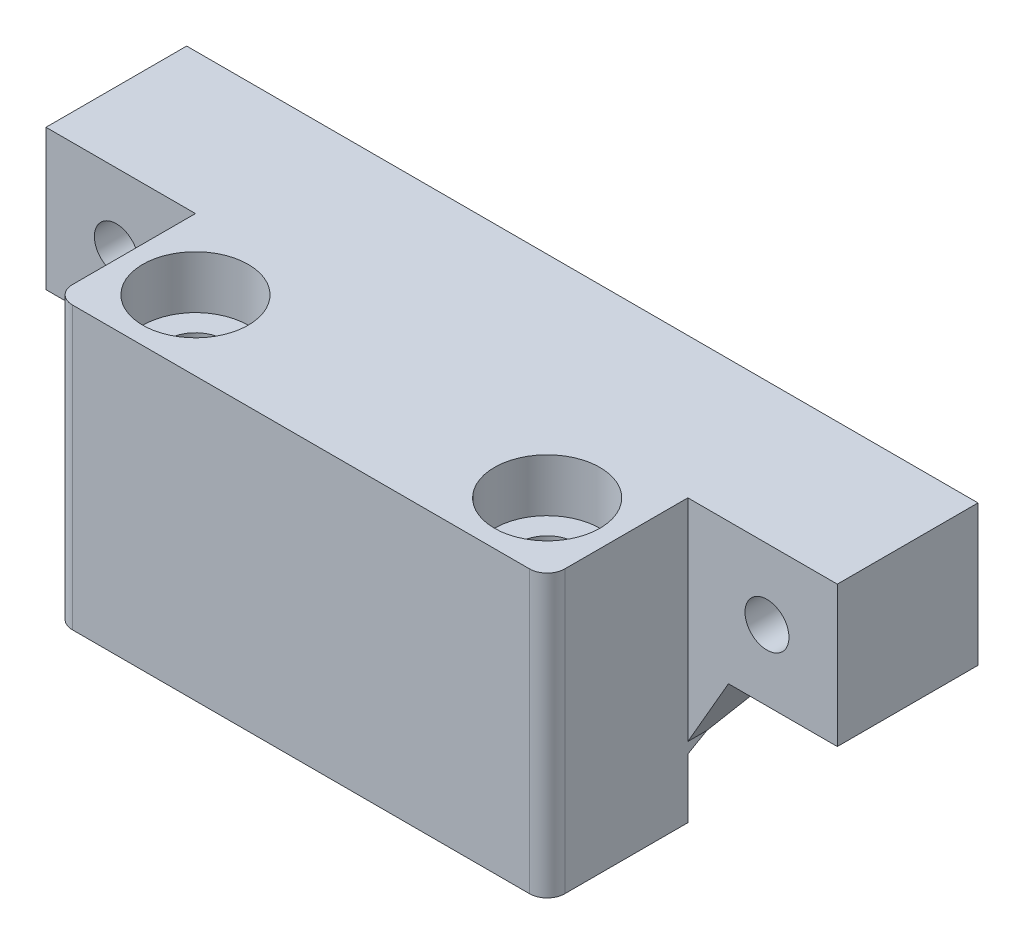
ISO-10303-21;
HEADER;
FILE_DESCRIPTION(('STEP AP214'),'2;1');
FILE_NAME('part.step','',(''),(''),'','','');
FILE_SCHEMA(('AUTOMOTIVE_DESIGN { 1 0 10303 214 1 1 1 1 }'));
ENDSEC;
DATA;
#1=APPLICATION_CONTEXT('core data for automotive mechanical design processes');
#2=APPLICATION_PROTOCOL_DEFINITION('international standard','automotive_design',2000,#1);
#3=PRODUCT_CONTEXT('',#1,'mechanical');
#4=PRODUCT('Part','Part','',(#3));
#5=PRODUCT_RELATED_PRODUCT_CATEGORY('part','',(#4));
#6=PRODUCT_DEFINITION_FORMATION('','',#4);
#7=PRODUCT_DEFINITION_CONTEXT('part definition',#1,'design');
#8=PRODUCT_DEFINITION('design','',#6,#7);
#9=PRODUCT_DEFINITION_SHAPE('','',#8);
#10=(LENGTH_UNIT() NAMED_UNIT(*) SI_UNIT(.MILLI.,.METRE.));
#11=(NAMED_UNIT(*) PLANE_ANGLE_UNIT() SI_UNIT($,.RADIAN.));
#12=(NAMED_UNIT(*) SI_UNIT($,.STERADIAN.) SOLID_ANGLE_UNIT());
#13=UNCERTAINTY_MEASURE_WITH_UNIT(LENGTH_MEASURE(1.E-05),#10,'distance_accuracy_value','');
#14=(GEOMETRIC_REPRESENTATION_CONTEXT(3) GLOBAL_UNCERTAINTY_ASSIGNED_CONTEXT((#13)) GLOBAL_UNIT_ASSIGNED_CONTEXT((#10,
#11,#12)) REPRESENTATION_CONTEXT('',''));
#15=CARTESIAN_POINT('',(0.,0.,0.));
#16=DIRECTION('',(0.,0.,1.));
#17=DIRECTION('',(1.,0.,0.));
#18=AXIS2_PLACEMENT_3D('',#15,#16,#17);
#19=CARTESIAN_POINT('',(-18.5,0.,8.));
#20=DIRECTION('',(0.,0.,-1.));
#21=DIRECTION('',(-1.,0.,0.));
#22=AXIS2_PLACEMENT_3D('',#19,#20,#21);
#23=CYLINDRICAL_SURFACE('',#22,1.25);
#24=CARTESIAN_POINT('',(-18.5,0.,8.));
#25=DIRECTION('',(0.,0.,1.));
#26=DIRECTION('',(1.,0.,0.));
#27=AXIS2_PLACEMENT_3D('',#24,#25,#26);
#28=CIRCLE('',#27,1.25);
#29=CARTESIAN_POINT('',(-17.25,0.,8.));
#30=VERTEX_POINT('',#29);
#31=EDGE_CURVE('E129',#30,#30,#28,.T.);
#32=ORIENTED_EDGE('',*,*,#31,.T.);
#33=EDGE_LOOP('',(#32));
#34=FACE_BOUND('',#33,.T.);
#35=CARTESIAN_POINT('',(-18.5,0.,5.));
#36=DIRECTION('',(0.,0.,-1.));
#37=DIRECTION('',(-1.,0.,0.));
#38=AXIS2_PLACEMENT_3D('',#35,#36,#37);
#39=CIRCLE('',#38,1.25);
#40=CARTESIAN_POINT('',(-19.75,0.,5.));
#41=VERTEX_POINT('',#40);
#42=EDGE_CURVE('E40',#41,#41,#39,.T.);
#43=ORIENTED_EDGE('',*,*,#42,.T.);
#44=EDGE_LOOP('',(#43));
#45=FACE_BOUND('',#44,.T.);
#46=ADVANCED_FACE('F35',(#34,#45),#23,.F.);
#47=CARTESIAN_POINT('',(18.5,0.,8.));
#48=DIRECTION('',(0.,0.,-1.));
#49=DIRECTION('',(-1.,0.,0.));
#50=AXIS2_PLACEMENT_3D('',#47,#48,#49);
#51=CYLINDRICAL_SURFACE('',#50,1.25);
#52=CARTESIAN_POINT('',(18.5,0.,8.));
#53=DIRECTION('',(0.,0.,1.));
#54=DIRECTION('',(-1.,0.,0.));
#55=AXIS2_PLACEMENT_3D('',#52,#53,#54);
#56=CIRCLE('',#55,1.25);
#57=CARTESIAN_POINT('',(17.25,0.,8.));
#58=VERTEX_POINT('',#57);
#59=EDGE_CURVE('E253',#58,#58,#56,.T.);
#60=ORIENTED_EDGE('',*,*,#59,.T.);
#61=EDGE_LOOP('',(#60));
#62=FACE_BOUND('',#61,.T.);
#63=CARTESIAN_POINT('',(18.5,0.,5.));
#64=DIRECTION('',(0.,0.,-1.));
#65=DIRECTION('',(-1.,0.,0.));
#66=AXIS2_PLACEMENT_3D('',#63,#64,#65);
#67=CIRCLE('',#66,1.25);
#68=CARTESIAN_POINT('',(17.25,0.,5.));
#69=VERTEX_POINT('',#68);
#70=EDGE_CURVE('E194',#69,#69,#67,.T.);
#71=ORIENTED_EDGE('',*,*,#70,.T.);
#72=EDGE_LOOP('',(#71));
#73=FACE_BOUND('',#72,.T.);
#74=ADVANCED_FACE('F378',(#62,#73),#51,.F.);
#75=CARTESIAN_POINT('',(-22.5,-4.,8.));
#76=DIRECTION('',(0.,1.,0.));
#77=DIRECTION('',(0.,0.,1.));
#78=AXIS2_PLACEMENT_3D('',#75,#76,#77);
#79=PLANE('',#78);
#80=DIRECTION('',(1.,0.,0.));
#81=VECTOR('',#80,1.);
#82=CARTESIAN_POINT('',(-22.5,-4.,8.));
#83=LINE('',#82,#81);
#84=CARTESIAN_POINT('',(16.3094010767585,-4.,8.));
#85=VERTEX_POINT('',#84);
#86=CARTESIAN_POINT('',(22.5,-4.,8.));
#87=VERTEX_POINT('',#86);
#88=EDGE_CURVE('E117',#85,#87,#83,.T.);
#89=ORIENTED_EDGE('',*,*,#88,.F.);
#90=DIRECTION('',(0.,0.,-1.));
#91=VECTOR('',#90,1.);
#92=CARTESIAN_POINT('',(16.3094010767585,-4.,8.00000000000001));
#93=LINE('',#92,#91);
#94=CARTESIAN_POINT('',(16.3094010767585,-4.,0.));
#95=VERTEX_POINT('',#94);
#96=EDGE_CURVE('E186',#85,#95,#93,.T.);
#97=ORIENTED_EDGE('',*,*,#96,.T.);
#98=DIRECTION('',(1.,0.,0.));
#99=VECTOR('',#98,1.);
#100=CARTESIAN_POINT('',(-22.5,-4.,0.));
#101=LINE('',#100,#99);
#102=CARTESIAN_POINT('',(22.5,-4.,0.));
#103=VERTEX_POINT('',#102);
#104=EDGE_CURVE('E135',#95,#103,#101,.T.);
#105=ORIENTED_EDGE('',*,*,#104,.T.);
#106=DIRECTION('',(0.,0.,-1.));
#107=VECTOR('',#106,1.);
#108=CARTESIAN_POINT('',(22.5,-4.,8.));
#109=LINE('',#108,#107);
#110=EDGE_CURVE('E116',#87,#103,#109,.T.);
#111=ORIENTED_EDGE('',*,*,#110,.F.);
#112=EDGE_LOOP('',(#89,#97,#105,#111));
#113=FACE_BOUND('',#112,.T.);
#114=ADVANCED_FACE('F336',(#113),#79,.F.);
#115=CARTESIAN_POINT('',(10.,4.,12.));
#116=DIRECTION('',(0.,-1.,0.));
#117=DIRECTION('',(0.,0.,-1.));
#118=AXIS2_PLACEMENT_3D('',#115,#116,#117);
#119=CYLINDRICAL_SURFACE('',#118,1.60000000000001);
#120=CARTESIAN_POINT('',(10.,-12.,12.));
#121=DIRECTION('',(0.,-1.,0.));
#122=DIRECTION('',(0.,0.,1.));
#123=AXIS2_PLACEMENT_3D('',#120,#121,#122);
#124=CIRCLE('',#123,1.60000000000001);
#125=CARTESIAN_POINT('',(10.,-12.,13.6));
#126=VERTEX_POINT('',#125);
#127=EDGE_CURVE('E153',#126,#126,#124,.T.);
#128=ORIENTED_EDGE('',*,*,#127,.T.);
#129=EDGE_LOOP('',(#128));
#130=FACE_BOUND('',#129,.T.);
#131=CARTESIAN_POINT('',(10.,1.,12.));
#132=DIRECTION('',(0.,1.,0.));
#133=DIRECTION('',(0.,0.,1.));
#134=AXIS2_PLACEMENT_3D('',#131,#132,#133);
#135=CIRCLE('',#134,1.60000000000001);
#136=CARTESIAN_POINT('',(10.,1.,13.6));
#137=VERTEX_POINT('',#136);
#138=EDGE_CURVE('E146',#137,#137,#135,.F.);
#139=ORIENTED_EDGE('',*,*,#138,.F.);
#140=EDGE_LOOP('',(#139));
#141=FACE_BOUND('',#140,.T.);
#142=ADVANCED_FACE('F365',(#130,#141),#119,.F.);
#143=CARTESIAN_POINT('',(0.,0.,8.));
#144=DIRECTION('',(0.,0.,1.));
#145=DIRECTION('',(1.,0.,0.));
#146=AXIS2_PLACEMENT_3D('',#143,#144,#145);
#147=PLANE('',#146);
#148=ORIENTED_EDGE('',*,*,#59,.F.);
#149=EDGE_LOOP('',(#148));
#150=FACE_BOUND('',#149,.T.);
#151=DIRECTION('',(-1.,0.,0.));
#152=VECTOR('',#151,1.);
#153=CARTESIAN_POINT('',(-22.5,4.,8.));
#154=LINE('',#153,#152);
#155=CARTESIAN_POINT('',(22.5,4.,8.));
#156=VERTEX_POINT('',#155);
#157=CARTESIAN_POINT('',(14.,4.,8.));
#158=VERTEX_POINT('',#157);
#159=EDGE_CURVE('E262',#156,#158,#154,.T.);
#160=ORIENTED_EDGE('',*,*,#159,.T.);
#161=DIRECTION('',(0.,-1.,0.));
#162=VECTOR('',#161,1.);
#163=CARTESIAN_POINT('',(14.,4.,8.));
#164=LINE('',#163,#162);
#165=CARTESIAN_POINT('',(14.,-8.00000000000001,8.));
#166=VERTEX_POINT('',#165);
#167=EDGE_CURVE('E251',#158,#166,#164,.T.);
#168=ORIENTED_EDGE('',*,*,#167,.T.);
#169=DIRECTION('',(0.500000000000006,0.866025403784435,0.));
#170=VECTOR('',#169,1.);
#171=CARTESIAN_POINT('',(16.3094010767585,-4.,8.00000000000001));
#172=LINE('',#171,#170);
#173=EDGE_CURVE('E82',#166,#85,#172,.T.);
#174=ORIENTED_EDGE('',*,*,#173,.T.);
#175=ORIENTED_EDGE('',*,*,#88,.T.);
#176=DIRECTION('',(0.,1.,0.));
#177=VECTOR('',#176,1.);
#178=CARTESIAN_POINT('',(22.5,4.,8.));
#179=LINE('',#178,#177);
#180=EDGE_CURVE('E136',#87,#156,#179,.T.);
#181=ORIENTED_EDGE('',*,*,#180,.T.);
#182=EDGE_LOOP('',(#160,#168,#174,#175,#181));
#183=FACE_BOUND('',#182,.T.);
#184=ADVANCED_FACE('F363',(#150,#183),#147,.T.);
#185=DIRECTION('',(0.,-1.,0.));
#186=VECTOR('',#185,1.);
#187=CARTESIAN_POINT('',(-14.,4.,8.));
#188=LINE('',#187,#186);
#189=CARTESIAN_POINT('',(-14.,4.,8.));
#190=VERTEX_POINT('',#189);
#191=CARTESIAN_POINT('',(-14.,-8.00000000000001,8.));
#192=VERTEX_POINT('',#191);
#193=EDGE_CURVE('E62',#190,#192,#188,.T.);
#194=ORIENTED_EDGE('',*,*,#193,.F.);
#195=CARTESIAN_POINT('',(-22.5,4.,8.));
#196=VERTEX_POINT('',#195);
#197=EDGE_CURVE('E261',#190,#196,#154,.T.);
#198=ORIENTED_EDGE('',*,*,#197,.T.);
#199=DIRECTION('',(0.,-1.,0.));
#200=VECTOR('',#199,1.);
#201=CARTESIAN_POINT('',(-22.5,4.,8.));
#202=LINE('',#201,#200);
#203=CARTESIAN_POINT('',(-22.5,-4.,8.));
#204=VERTEX_POINT('',#203);
#205=EDGE_CURVE('E114',#196,#204,#202,.T.);
#206=ORIENTED_EDGE('',*,*,#205,.T.);
#207=CARTESIAN_POINT('',(-16.3094010767586,-4.,8.));
#208=VERTEX_POINT('',#207);
#209=EDGE_CURVE('E105',#204,#208,#83,.T.);
#210=ORIENTED_EDGE('',*,*,#209,.T.);
#211=DIRECTION('',(0.500000000000006,-0.866025403784435,0.));
#212=VECTOR('',#211,1.);
#213=CARTESIAN_POINT('',(-16.3094010767585,-4.,8.));
#214=LINE('',#213,#212);
#215=EDGE_CURVE('E45',#208,#192,#214,.T.);
#216=ORIENTED_EDGE('',*,*,#215,.T.);
#217=EDGE_LOOP('',(#194,#198,#206,#210,#216));
#218=FACE_BOUND('',#217,.T.);
#219=ORIENTED_EDGE('',*,*,#31,.F.);
#220=EDGE_LOOP('',(#219));
#221=FACE_BOUND('',#220,.T.);
#222=ADVANCED_FACE('F110',(#218,#221),#147,.T.);
#223=CARTESIAN_POINT('',(0.,0.,0.));
#224=DIRECTION('',(0.,0.,1.));
#225=DIRECTION('',(1.,0.,0.));
#226=AXIS2_PLACEMENT_3D('',#223,#224,#225);
#227=PLANE('',#226);
#228=CARTESIAN_POINT('',(18.5,0.,0.));
#229=DIRECTION('',(0.,0.,-1.));
#230=DIRECTION('',(-1.,0.,0.));
#231=AXIS2_PLACEMENT_3D('',#228,#229,#230);
#232=CIRCLE('',#231,2.1);
#233=CARTESIAN_POINT('',(16.4,0.,0.));
#234=VERTEX_POINT('',#233);
#235=EDGE_CURVE('E202',#234,#234,#232,.T.);
#236=ORIENTED_EDGE('',*,*,#235,.F.);
#237=EDGE_LOOP('',(#236));
#238=FACE_BOUND('',#237,.T.);
#239=CARTESIAN_POINT('',(-18.5,0.,0.));
#240=DIRECTION('',(0.,0.,-1.));
#241=DIRECTION('',(-1.,0.,0.));
#242=AXIS2_PLACEMENT_3D('',#239,#240,#241);
#243=CIRCLE('',#242,2.1);
#244=CARTESIAN_POINT('',(-20.6,0.,0.));
#245=VERTEX_POINT('',#244);
#246=EDGE_CURVE('E212',#245,#245,#243,.T.);
#247=ORIENTED_EDGE('',*,*,#246,.F.);
#248=EDGE_LOOP('',(#247));
#249=FACE_BOUND('',#248,.T.);
#250=DIRECTION('',(0.,1.,0.));
#251=VECTOR('',#250,1.);
#252=CARTESIAN_POINT('',(22.5,4.,0.));
#253=LINE('',#252,#251);
#254=CARTESIAN_POINT('',(22.5,4.,0.));
#255=VERTEX_POINT('',#254);
#256=EDGE_CURVE('E125',#103,#255,#253,.T.);
#257=ORIENTED_EDGE('',*,*,#256,.F.);
#258=ORIENTED_EDGE('',*,*,#104,.F.);
#259=CARTESIAN_POINT('',(-16.3094010767586,-4.,0.));
#260=VERTEX_POINT('',#259);
#261=EDGE_CURVE('E53',#260,#95,#101,.T.);
#262=ORIENTED_EDGE('',*,*,#261,.F.);
#263=CARTESIAN_POINT('',(-22.5,-4.,0.));
#264=VERTEX_POINT('',#263);
#265=EDGE_CURVE('E106',#264,#260,#101,.T.);
#266=ORIENTED_EDGE('',*,*,#265,.F.);
#267=DIRECTION('',(0.,-1.,0.));
#268=VECTOR('',#267,1.);
#269=CARTESIAN_POINT('',(-22.5,4.,0.));
#270=LINE('',#269,#268);
#271=CARTESIAN_POINT('',(-22.5,4.,0.));
#272=VERTEX_POINT('',#271);
#273=EDGE_CURVE('E132',#272,#264,#270,.T.);
#274=ORIENTED_EDGE('',*,*,#273,.F.);
#275=DIRECTION('',(-1.,0.,0.));
#276=VECTOR('',#275,1.);
#277=CARTESIAN_POINT('',(-22.5,4.,0.));
#278=LINE('',#277,#276);
#279=EDGE_CURVE('E128',#255,#272,#278,.T.);
#280=ORIENTED_EDGE('',*,*,#279,.F.);
#281=EDGE_LOOP('',(#257,#258,#262,#266,#274,#280));
#282=FACE_BOUND('',#281,.T.);
#283=ADVANCED_FACE('F287',(#238,#249,#282),#227,.F.);
#284=CARTESIAN_POINT('',(22.5,4.,8.));
#285=DIRECTION('',(-1.,0.,0.));
#286=DIRECTION('',(0.,0.,1.));
#287=AXIS2_PLACEMENT_3D('',#284,#285,#286);
#288=PLANE('',#287);
#289=ORIENTED_EDGE('',*,*,#256,.T.);
#290=DIRECTION('',(0.,0.,-1.));
#291=VECTOR('',#290,1.);
#292=CARTESIAN_POINT('',(22.5,4.,8.));
#293=LINE('',#292,#291);
#294=EDGE_CURVE('E142',#156,#255,#293,.T.);
#295=ORIENTED_EDGE('',*,*,#294,.F.);
#296=ORIENTED_EDGE('',*,*,#180,.F.);
#297=ORIENTED_EDGE('',*,*,#110,.T.);
#298=EDGE_LOOP('',(#289,#295,#296,#297));
#299=FACE_BOUND('',#298,.T.);
#300=ADVANCED_FACE('F340',(#299),#288,.F.);
#301=CARTESIAN_POINT('',(-22.5,4.,8.));
#302=DIRECTION('',(0.,-1.,0.));
#303=DIRECTION('',(0.,0.,-1.));
#304=AXIS2_PLACEMENT_3D('',#301,#302,#303);
#305=PLANE('',#304);
#306=CARTESIAN_POINT('',(10.,4.,12.));
#307=DIRECTION('',(0.,1.,0.));
#308=DIRECTION('',(0.,0.,1.));
#309=AXIS2_PLACEMENT_3D('',#306,#307,#308);
#310=CIRCLE('',#309,3.);
#311=CARTESIAN_POINT('',(10.,4.,15.));
#312=VERTEX_POINT('',#311);
#313=EDGE_CURVE('E217',#312,#312,#310,.T.);
#314=ORIENTED_EDGE('',*,*,#313,.F.);
#315=EDGE_LOOP('',(#314));
#316=FACE_BOUND('',#315,.T.);
#317=CARTESIAN_POINT('',(-10.,4.,12.));
#318=DIRECTION('',(0.,1.,0.));
#319=DIRECTION('',(0.,0.,-1.));
#320=AXIS2_PLACEMENT_3D('',#317,#318,#319);
#321=CIRCLE('',#320,3.);
#322=CARTESIAN_POINT('',(-10.,4.,9.));
#323=VERTEX_POINT('',#322);
#324=EDGE_CURVE('E200',#323,#323,#321,.T.);
#325=ORIENTED_EDGE('',*,*,#324,.F.);
#326=EDGE_LOOP('',(#325));
#327=FACE_BOUND('',#326,.T.);
#328=DIRECTION('',(0.,0.,-1.));
#329=VECTOR('',#328,1.);
#330=CARTESIAN_POINT('',(-14.,4.,16.));
#331=LINE('',#330,#329);
#332=CARTESIAN_POINT('',(-14.,4.,15.));
#333=VERTEX_POINT('',#332);
#334=EDGE_CURVE('E248',#333,#190,#331,.T.);
#335=ORIENTED_EDGE('',*,*,#334,.F.);
#336=CARTESIAN_POINT('',(-13.,4.,15.));
#337=DIRECTION('',(0.,-1.,0.));
#338=DIRECTION('',(0.,0.,-1.));
#339=AXIS2_PLACEMENT_3D('',#336,#337,#338);
#340=CIRCLE('',#339,1.);
#341=CARTESIAN_POINT('',(-13.,4.,16.));
#342=VERTEX_POINT('',#341);
#343=EDGE_CURVE('E171',#333,#342,#340,.F.);
#344=ORIENTED_EDGE('',*,*,#343,.T.);
#345=DIRECTION('',(-1.,0.,0.));
#346=VECTOR('',#345,1.);
#347=CARTESIAN_POINT('',(-14.,4.,16.));
#348=LINE('',#347,#346);
#349=CARTESIAN_POINT('',(13.,4.,16.));
#350=VERTEX_POINT('',#349);
#351=EDGE_CURVE('E245',#350,#342,#348,.T.);
#352=ORIENTED_EDGE('',*,*,#351,.F.);
#353=CARTESIAN_POINT('',(13.,4.,15.));
#354=DIRECTION('',(0.,-1.,0.));
#355=DIRECTION('',(0.,0.,-1.));
#356=AXIS2_PLACEMENT_3D('',#353,#354,#355);
#357=CIRCLE('',#356,1.);
#358=CARTESIAN_POINT('',(14.,4.,15.));
#359=VERTEX_POINT('',#358);
#360=EDGE_CURVE('E168',#350,#359,#357,.F.);
#361=ORIENTED_EDGE('',*,*,#360,.T.);
#362=DIRECTION('',(0.,0.,1.));
#363=VECTOR('',#362,1.);
#364=CARTESIAN_POINT('',(14.,4.,16.));
#365=LINE('',#364,#363);
#366=EDGE_CURVE('E242',#158,#359,#365,.T.);
#367=ORIENTED_EDGE('',*,*,#366,.F.);
#368=ORIENTED_EDGE('',*,*,#159,.F.);
#369=ORIENTED_EDGE('',*,*,#294,.T.);
#370=ORIENTED_EDGE('',*,*,#279,.T.);
#371=DIRECTION('',(0.,0.,-1.));
#372=VECTOR('',#371,1.);
#373=CARTESIAN_POINT('',(-22.5,4.,8.));
#374=LINE('',#373,#372);
#375=EDGE_CURVE('E139',#196,#272,#374,.T.);
#376=ORIENTED_EDGE('',*,*,#375,.F.);
#377=ORIENTED_EDGE('',*,*,#197,.F.);
#378=EDGE_LOOP('',(#335,#344,#352,#361,#367,#368,#369,#370,#376,#377));
#379=FACE_BOUND('',#378,.T.);
#380=ADVANCED_FACE('F275',(#316,#327,#379),#305,.F.);
#381=CARTESIAN_POINT('',(-22.5,4.,8.));
#382=DIRECTION('',(1.,0.,0.));
#383=DIRECTION('',(0.,0.,-1.));
#384=AXIS2_PLACEMENT_3D('',#381,#382,#383);
#385=PLANE('',#384);
#386=ORIENTED_EDGE('',*,*,#273,.T.);
#387=DIRECTION('',(0.,0.,-1.));
#388=VECTOR('',#387,1.);
#389=CARTESIAN_POINT('',(-22.5,-4.,8.));
#390=LINE('',#389,#388);
#391=EDGE_CURVE('E120',#204,#264,#390,.T.);
#392=ORIENTED_EDGE('',*,*,#391,.F.);
#393=ORIENTED_EDGE('',*,*,#205,.F.);
#394=ORIENTED_EDGE('',*,*,#375,.T.);
#395=EDGE_LOOP('',(#386,#392,#393,#394));
#396=FACE_BOUND('',#395,.T.);
#397=ADVANCED_FACE('F280',(#396),#385,.F.);
#398=ORIENTED_EDGE('',*,*,#265,.T.);
#399=DIRECTION('',(0.,0.,1.));
#400=VECTOR('',#399,1.);
#401=CARTESIAN_POINT('',(-16.3094010767585,-4.,8.));
#402=LINE('',#401,#400);
#403=EDGE_CURVE('E95',#260,#208,#402,.T.);
#404=ORIENTED_EDGE('',*,*,#403,.T.);
#405=ORIENTED_EDGE('',*,*,#209,.F.);
#406=ORIENTED_EDGE('',*,*,#391,.T.);
#407=EDGE_LOOP('',(#398,#404,#405,#406));
#408=FACE_BOUND('',#407,.T.);
#409=ADVANCED_FACE('F102',(#408),#79,.F.);
#410=CARTESIAN_POINT('',(14.,4.,16.));
#411=DIRECTION('',(1.,0.,0.));
#412=DIRECTION('',(0.,0.,-1.));
#413=AXIS2_PLACEMENT_3D('',#410,#411,#412);
#414=PLANE('',#413);
#415=DIRECTION('',(0.,0.500000000000004,-0.866025403784436));
#416=VECTOR('',#415,1.);
#417=CARTESIAN_POINT('',(14.,-8.61880215351703,8.00000000000001));
#418=LINE('',#417,#416);
#419=CARTESIAN_POINT('',(14.,-8.61880215351703,8.));
#420=VERTEX_POINT('',#419);
#421=CARTESIAN_POINT('',(14.,-8.00000000000001,6.9282032302755));
#422=VERTEX_POINT('',#421);
#423=EDGE_CURVE('E180',#420,#422,#418,.T.);
#424=ORIENTED_EDGE('',*,*,#423,.T.);
#425=DIRECTION('',(0.,0.,1.));
#426=VECTOR('',#425,1.);
#427=CARTESIAN_POINT('',(14.,-8.00000000000001,16.));
#428=LINE('',#427,#426);
#429=EDGE_CURVE('E107',#422,#166,#428,.T.);
#430=ORIENTED_EDGE('',*,*,#429,.T.);
#431=ORIENTED_EDGE('',*,*,#167,.F.);
#432=ORIENTED_EDGE('',*,*,#366,.T.);
#433=DIRECTION('',(0.,-1.,0.));
#434=VECTOR('',#433,1.);
#435=CARTESIAN_POINT('',(14.,4.,15.));
#436=LINE('',#435,#434);
#437=CARTESIAN_POINT('',(14.,-12.,15.));
#438=VERTEX_POINT('',#437);
#439=EDGE_CURVE('E174',#359,#438,#436,.T.);
#440=ORIENTED_EDGE('',*,*,#439,.T.);
#441=DIRECTION('',(0.,0.,1.));
#442=VECTOR('',#441,1.);
#443=CARTESIAN_POINT('',(14.,-12.,16.));
#444=LINE('',#443,#442);
#445=CARTESIAN_POINT('',(14.,-12.,8.));
#446=VERTEX_POINT('',#445);
#447=EDGE_CURVE('E230',#446,#438,#444,.T.);
#448=ORIENTED_EDGE('',*,*,#447,.F.);
#449=EDGE_CURVE('E254',#420,#446,#164,.T.);
#450=ORIENTED_EDGE('',*,*,#449,.F.);
#451=EDGE_LOOP('',(#424,#430,#431,#432,#440,#448,#450));
#452=FACE_BOUND('',#451,.T.);
#453=ADVANCED_FACE('F330',(#452),#414,.T.);
#454=CARTESIAN_POINT('',(-14.,4.,8.));
#455=DIRECTION('',(0.,0.,-1.));
#456=DIRECTION('',(-1.,0.,0.));
#457=AXIS2_PLACEMENT_3D('',#454,#455,#456);
#458=PLANE('',#457);
#459=CARTESIAN_POINT('',(-14.,-8.61880215351703,8.));
#460=VERTEX_POINT('',#459);
#461=CARTESIAN_POINT('',(-14.,-12.,8.));
#462=VERTEX_POINT('',#461);
#463=EDGE_CURVE('E250',#460,#462,#188,.T.);
#464=ORIENTED_EDGE('',*,*,#463,.F.);
#465=DIRECTION('',(1.,0.,0.));
#466=VECTOR('',#465,1.);
#467=CARTESIAN_POINT('',(-14.,-8.61880215351703,8.));
#468=LINE('',#467,#466);
#469=EDGE_CURVE('E177',#460,#420,#468,.T.);
#470=ORIENTED_EDGE('',*,*,#469,.T.);
#471=ORIENTED_EDGE('',*,*,#449,.T.);
#472=DIRECTION('',(1.,0.,0.));
#473=VECTOR('',#472,1.);
#474=CARTESIAN_POINT('',(-14.,-12.,8.));
#475=LINE('',#474,#473);
#476=EDGE_CURVE('E239',#462,#446,#475,.T.);
#477=ORIENTED_EDGE('',*,*,#476,.F.);
#478=EDGE_LOOP('',(#464,#470,#471,#477));
#479=FACE_BOUND('',#478,.T.);
#480=ADVANCED_FACE('F324',(#479),#458,.T.);
#481=CARTESIAN_POINT('',(-14.,4.,16.));
#482=DIRECTION('',(-1.,0.,0.));
#483=DIRECTION('',(0.,0.,1.));
#484=AXIS2_PLACEMENT_3D('',#481,#482,#483);
#485=PLANE('',#484);
#486=ORIENTED_EDGE('',*,*,#193,.T.);
#487=DIRECTION('',(0.,0.,-1.));
#488=VECTOR('',#487,1.);
#489=CARTESIAN_POINT('',(-14.,-8.00000000000001,16.));
#490=LINE('',#489,#488);
#491=CARTESIAN_POINT('',(-14.,-8.00000000000001,6.9282032302755));
#492=VERTEX_POINT('',#491);
#493=EDGE_CURVE('E96',#192,#492,#490,.T.);
#494=ORIENTED_EDGE('',*,*,#493,.T.);
#495=DIRECTION('',(0.,-0.500000000000004,0.866025403784436));
#496=VECTOR('',#495,1.);
#497=CARTESIAN_POINT('',(-14.,-8.61880215351703,8.));
#498=LINE('',#497,#496);
#499=EDGE_CURVE('E183',#492,#460,#498,.T.);
#500=ORIENTED_EDGE('',*,*,#499,.T.);
#501=ORIENTED_EDGE('',*,*,#463,.T.);
#502=DIRECTION('',(0.,0.,-1.));
#503=VECTOR('',#502,1.);
#504=CARTESIAN_POINT('',(-14.,-12.,16.));
#505=LINE('',#504,#503);
#506=CARTESIAN_POINT('',(-14.,-12.,15.));
#507=VERTEX_POINT('',#506);
#508=EDGE_CURVE('E236',#507,#462,#505,.T.);
#509=ORIENTED_EDGE('',*,*,#508,.F.);
#510=DIRECTION('',(0.,-1.,0.));
#511=VECTOR('',#510,1.);
#512=CARTESIAN_POINT('',(-14.,4.,15.));
#513=LINE('',#512,#511);
#514=EDGE_CURVE('E165',#507,#333,#513,.F.);
#515=ORIENTED_EDGE('',*,*,#514,.T.);
#516=ORIENTED_EDGE('',*,*,#334,.T.);
#517=EDGE_LOOP('',(#486,#494,#500,#501,#509,#515,#516));
#518=FACE_BOUND('',#517,.T.);
#519=ADVANCED_FACE('F318',(#518),#485,.T.);
#520=CARTESIAN_POINT('',(-14.,4.,16.));
#521=DIRECTION('',(0.,0.,1.));
#522=DIRECTION('',(1.,0.,0.));
#523=AXIS2_PLACEMENT_3D('',#520,#521,#522);
#524=PLANE('',#523);
#525=ORIENTED_EDGE('',*,*,#351,.T.);
#526=DIRECTION('',(0.,-1.,0.));
#527=VECTOR('',#526,1.);
#528=CARTESIAN_POINT('',(-13.,4.,16.));
#529=LINE('',#528,#527);
#530=CARTESIAN_POINT('',(-13.,-12.,16.));
#531=VERTEX_POINT('',#530);
#532=EDGE_CURVE('E156',#342,#531,#529,.T.);
#533=ORIENTED_EDGE('',*,*,#532,.T.);
#534=DIRECTION('',(-1.,0.,0.));
#535=VECTOR('',#534,1.);
#536=CARTESIAN_POINT('',(-14.,-12.,16.));
#537=LINE('',#536,#535);
#538=CARTESIAN_POINT('',(13.,-12.,16.));
#539=VERTEX_POINT('',#538);
#540=EDGE_CURVE('E233',#539,#531,#537,.T.);
#541=ORIENTED_EDGE('',*,*,#540,.F.);
#542=DIRECTION('',(0.,-1.,0.));
#543=VECTOR('',#542,1.);
#544=CARTESIAN_POINT('',(13.,4.,16.));
#545=LINE('',#544,#543);
#546=EDGE_CURVE('E145',#539,#350,#545,.F.);
#547=ORIENTED_EDGE('',*,*,#546,.T.);
#548=EDGE_LOOP('',(#525,#533,#541,#547));
#549=FACE_BOUND('',#548,.T.);
#550=ADVANCED_FACE('F356',(#549),#524,.T.);
#551=CARTESIAN_POINT('',(-10.,4.,12.));
#552=DIRECTION('',(0.,-1.,0.));
#553=DIRECTION('',(0.,0.,-1.));
#554=AXIS2_PLACEMENT_3D('',#551,#552,#553);
#555=CYLINDRICAL_SURFACE('',#554,1.6);
#556=CARTESIAN_POINT('',(-10.,1.,12.));
#557=DIRECTION('',(0.,-1.,0.));
#558=DIRECTION('',(0.,0.,-1.));
#559=AXIS2_PLACEMENT_3D('',#556,#557,#558);
#560=CIRCLE('',#559,1.6);
#561=CARTESIAN_POINT('',(-10.,1.,10.4));
#562=VERTEX_POINT('',#561);
#563=EDGE_CURVE('E149',#562,#562,#560,.F.);
#564=ORIENTED_EDGE('',*,*,#563,.T.);
#565=EDGE_LOOP('',(#564));
#566=FACE_BOUND('',#565,.T.);
#567=CARTESIAN_POINT('',(-10.,-12.,12.));
#568=DIRECTION('',(0.,-1.,0.));
#569=DIRECTION('',(0.,0.,-1.));
#570=AXIS2_PLACEMENT_3D('',#567,#568,#569);
#571=CIRCLE('',#570,1.6);
#572=CARTESIAN_POINT('',(-10.,-12.,10.4));
#573=VERTEX_POINT('',#572);
#574=EDGE_CURVE('E227',#573,#573,#571,.T.);
#575=ORIENTED_EDGE('',*,*,#574,.T.);
#576=EDGE_LOOP('',(#575));
#577=FACE_BOUND('',#576,.T.);
#578=ADVANCED_FACE('F391',(#566,#577),#555,.F.);
#579=CARTESIAN_POINT('',(0.,-12.,0.));
#580=DIRECTION('',(0.,-1.,0.));
#581=DIRECTION('',(0.,0.,-1.));
#582=AXIS2_PLACEMENT_3D('',#579,#580,#581);
#583=PLANE('',#582);
#584=ORIENTED_EDGE('',*,*,#574,.F.);
#585=EDGE_LOOP('',(#584));
#586=FACE_BOUND('',#585,.T.);
#587=ORIENTED_EDGE('',*,*,#540,.T.);
#588=CARTESIAN_POINT('',(-13.,-12.,15.));
#589=DIRECTION('',(0.,-1.,0.));
#590=DIRECTION('',(0.,0.,-1.));
#591=AXIS2_PLACEMENT_3D('',#588,#589,#590);
#592=CIRCLE('',#591,1.);
#593=EDGE_CURVE('E162',#531,#507,#592,.T.);
#594=ORIENTED_EDGE('',*,*,#593,.T.);
#595=ORIENTED_EDGE('',*,*,#508,.T.);
#596=ORIENTED_EDGE('',*,*,#476,.T.);
#597=ORIENTED_EDGE('',*,*,#447,.T.);
#598=CARTESIAN_POINT('',(13.,-12.,15.));
#599=DIRECTION('',(0.,-1.,0.));
#600=DIRECTION('',(0.,0.,-1.));
#601=AXIS2_PLACEMENT_3D('',#598,#599,#600);
#602=CIRCLE('',#601,1.);
#603=EDGE_CURVE('E159',#438,#539,#602,.T.);
#604=ORIENTED_EDGE('',*,*,#603,.T.);
#605=EDGE_LOOP('',(#587,#594,#595,#596,#597,#604));
#606=FACE_BOUND('',#605,.T.);
#607=ORIENTED_EDGE('',*,*,#127,.F.);
#608=EDGE_LOOP('',(#607));
#609=FACE_BOUND('',#608,.T.);
#610=ADVANCED_FACE('F346',(#586,#606,#609),#583,.T.);
#611=CARTESIAN_POINT('',(10.,1.,12.));
#612=DIRECTION('',(0.,1.,0.));
#613=DIRECTION('',(0.,0.,1.));
#614=AXIS2_PLACEMENT_3D('',#611,#612,#613);
#615=PLANE('',#614);
#616=CARTESIAN_POINT('',(10.,1.,12.));
#617=DIRECTION('',(0.,1.,0.));
#618=DIRECTION('',(0.,0.,1.));
#619=AXIS2_PLACEMENT_3D('',#616,#617,#618);
#620=CIRCLE('',#619,3.);
#621=CARTESIAN_POINT('',(10.,1.,15.));
#622=VERTEX_POINT('',#621);
#623=EDGE_CURVE('E150',#622,#622,#620,.T.);
#624=ORIENTED_EDGE('',*,*,#623,.T.);
#625=EDGE_LOOP('',(#624));
#626=FACE_BOUND('',#625,.T.);
#627=ORIENTED_EDGE('',*,*,#138,.T.);
#628=EDGE_LOOP('',(#627));
#629=FACE_BOUND('',#628,.T.);
#630=ADVANCED_FACE('F401',(#626,#629),#615,.T.);
#631=CARTESIAN_POINT('',(10.,1.,12.));
#632=DIRECTION('',(0.,1.,0.));
#633=DIRECTION('',(0.,0.,1.));
#634=AXIS2_PLACEMENT_3D('',#631,#632,#633);
#635=CYLINDRICAL_SURFACE('',#634,3.);
#636=ORIENTED_EDGE('',*,*,#623,.F.);
#637=EDGE_LOOP('',(#636));
#638=FACE_BOUND('',#637,.T.);
#639=ORIENTED_EDGE('',*,*,#313,.T.);
#640=EDGE_LOOP('',(#639));
#641=FACE_BOUND('',#640,.T.);
#642=ADVANCED_FACE('F410',(#638,#641),#635,.F.);
#643=CARTESIAN_POINT('',(-10.,1.,12.));
#644=DIRECTION('',(0.,-1.,0.));
#645=DIRECTION('',(0.,0.,-1.));
#646=AXIS2_PLACEMENT_3D('',#643,#644,#645);
#647=PLANE('',#646);
#648=CARTESIAN_POINT('',(-10.,1.,12.));
#649=DIRECTION('',(0.,1.,0.));
#650=DIRECTION('',(0.,0.,-1.));
#651=AXIS2_PLACEMENT_3D('',#648,#649,#650);
#652=CIRCLE('',#651,3.);
#653=CARTESIAN_POINT('',(-10.,1.,9.));
#654=VERTEX_POINT('',#653);
#655=EDGE_CURVE('E220',#654,#654,#652,.T.);
#656=ORIENTED_EDGE('',*,*,#655,.T.);
#657=EDGE_LOOP('',(#656));
#658=FACE_BOUND('',#657,.T.);
#659=ORIENTED_EDGE('',*,*,#563,.F.);
#660=EDGE_LOOP('',(#659));
#661=FACE_BOUND('',#660,.T.);
#662=ADVANCED_FACE('F406',(#658,#661),#647,.F.);
#663=CARTESIAN_POINT('',(-10.,1.,12.));
#664=DIRECTION('',(0.,1.,0.));
#665=DIRECTION('',(0.,0.,1.));
#666=AXIS2_PLACEMENT_3D('',#663,#664,#665);
#667=CYLINDRICAL_SURFACE('',#666,3.);
#668=ORIENTED_EDGE('',*,*,#655,.F.);
#669=EDGE_LOOP('',(#668));
#670=FACE_BOUND('',#669,.T.);
#671=ORIENTED_EDGE('',*,*,#324,.T.);
#672=EDGE_LOOP('',(#671));
#673=FACE_BOUND('',#672,.T.);
#674=ADVANCED_FACE('F403',(#670,#673),#667,.F.);
#675=CARTESIAN_POINT('',(-13.,4.,15.));
#676=DIRECTION('',(0.,-1.,0.));
#677=DIRECTION('',(0.,0.,-1.));
#678=AXIS2_PLACEMENT_3D('',#675,#676,#677);
#679=CYLINDRICAL_SURFACE('',#678,1.);
#680=ORIENTED_EDGE('',*,*,#343,.F.);
#681=ORIENTED_EDGE('',*,*,#514,.F.);
#682=ORIENTED_EDGE('',*,*,#593,.F.);
#683=ORIENTED_EDGE('',*,*,#532,.F.);
#684=EDGE_LOOP('',(#680,#681,#682,#683));
#685=FACE_BOUND('',#684,.T.);
#686=ADVANCED_FACE('F361',(#685),#679,.T.);
#687=CARTESIAN_POINT('',(13.,4.,15.));
#688=DIRECTION('',(0.,-1.,0.));
#689=DIRECTION('',(0.,0.,-1.));
#690=AXIS2_PLACEMENT_3D('',#687,#688,#689);
#691=CYLINDRICAL_SURFACE('',#690,1.);
#692=ORIENTED_EDGE('',*,*,#360,.F.);
#693=ORIENTED_EDGE('',*,*,#546,.F.);
#694=ORIENTED_EDGE('',*,*,#603,.F.);
#695=ORIENTED_EDGE('',*,*,#439,.F.);
#696=EDGE_LOOP('',(#692,#693,#694,#695));
#697=FACE_BOUND('',#696,.T.);
#698=ADVANCED_FACE('F352',(#697),#691,.T.);
#699=CARTESIAN_POINT('',(-14.,-8.61880215351703,8.));
#700=DIRECTION('',(0.,0.866025403784436,0.500000000000004));
#701=DIRECTION('',(1.,0.,0.));
#702=AXIS2_PLACEMENT_3D('',#699,#700,#701);
#703=PLANE('',#702);
#704=ORIENTED_EDGE('',*,*,#499,.F.);
#705=DIRECTION('',(-0.277350098112621,0.480384461415265,-0.83205029433784));
#706=VECTOR('',#705,1.);
#707=CARTESIAN_POINT('',(-13.6702163785463,-8.57120198786187,7.91755409463657));
#708=LINE('',#707,#706);
#709=EDGE_CURVE('E11',#492,#260,#708,.T.);
#710=ORIENTED_EDGE('',*,*,#709,.T.);
#711=ORIENTED_EDGE('',*,*,#261,.T.);
#712=DIRECTION('',(-0.277350098112621,-0.480384461415265,0.83205029433784));
#713=VECTOR('',#712,1.);
#714=CARTESIAN_POINT('',(11.5163702247001,-12.3017729580103,14.3790925561752));
#715=LINE('',#714,#713);
#716=EDGE_CURVE('E192',#95,#422,#715,.T.);
#717=ORIENTED_EDGE('',*,*,#716,.T.);
#718=ORIENTED_EDGE('',*,*,#423,.F.);
#719=ORIENTED_EDGE('',*,*,#469,.F.);
#720=EDGE_LOOP('',(#704,#710,#711,#717,#718,#719));
#721=FACE_BOUND('',#720,.T.);
#722=ADVANCED_FACE('F327',(#721),#703,.F.);
#723=CARTESIAN_POINT('',(16.3094010767585,-4.,8.00000000000001));
#724=DIRECTION('',(-0.866025403784435,0.500000000000006,0.));
#725=DIRECTION('',(0.,0.,-1.));
#726=AXIS2_PLACEMENT_3D('',#723,#724,#725);
#727=PLANE('',#726);
#728=ORIENTED_EDGE('',*,*,#173,.F.);
#729=ORIENTED_EDGE('',*,*,#429,.F.);
#730=ORIENTED_EDGE('',*,*,#716,.F.);
#731=ORIENTED_EDGE('',*,*,#96,.F.);
#732=EDGE_LOOP('',(#728,#729,#730,#731));
#733=FACE_BOUND('',#732,.T.);
#734=ADVANCED_FACE('F333',(#733),#727,.F.);
#735=CARTESIAN_POINT('',(-16.3094010767585,-4.,8.));
#736=DIRECTION('',(0.866025403784435,0.500000000000006,0.));
#737=DIRECTION('',(0.,0.,1.));
#738=AXIS2_PLACEMENT_3D('',#735,#736,#737);
#739=PLANE('',#738);
#740=ORIENTED_EDGE('',*,*,#709,.F.);
#741=ORIENTED_EDGE('',*,*,#493,.F.);
#742=ORIENTED_EDGE('',*,*,#215,.F.);
#743=ORIENTED_EDGE('',*,*,#403,.F.);
#744=EDGE_LOOP('',(#740,#741,#742,#743));
#745=FACE_BOUND('',#744,.T.);
#746=ADVANCED_FACE('F38',(#745),#739,.F.);
#747=CARTESIAN_POINT('',(18.5,0.,5.));
#748=DIRECTION('',(0.,0.,-1.));
#749=DIRECTION('',(-1.,0.,0.));
#750=AXIS2_PLACEMENT_3D('',#747,#748,#749);
#751=CYLINDRICAL_SURFACE('',#750,2.1);
#752=CARTESIAN_POINT('',(18.5,0.,5.));
#753=DIRECTION('',(0.,0.,-1.));
#754=DIRECTION('',(-1.,0.,0.));
#755=AXIS2_PLACEMENT_3D('',#752,#753,#754);
#756=CIRCLE('',#755,2.1);
#757=CARTESIAN_POINT('',(16.4,0.,5.));
#758=VERTEX_POINT('',#757);
#759=EDGE_CURVE('E196',#758,#758,#756,.T.);
#760=ORIENTED_EDGE('',*,*,#759,.F.);
#761=EDGE_LOOP('',(#760));
#762=FACE_BOUND('',#761,.T.);
#763=ORIENTED_EDGE('',*,*,#235,.T.);
#764=EDGE_LOOP('',(#763));
#765=FACE_BOUND('',#764,.T.);
#766=ADVANCED_FACE('F427',(#762,#765),#751,.F.);
#767=CARTESIAN_POINT('',(18.5,0.,5.));
#768=DIRECTION('',(0.,0.,-1.));
#769=DIRECTION('',(-1.,0.,0.));
#770=AXIS2_PLACEMENT_3D('',#767,#768,#769);
#771=PLANE('',#770);
#772=ORIENTED_EDGE('',*,*,#70,.F.);
#773=EDGE_LOOP('',(#772));
#774=FACE_BOUND('',#773,.T.);
#775=ORIENTED_EDGE('',*,*,#759,.T.);
#776=EDGE_LOOP('',(#775));
#777=FACE_BOUND('',#776,.T.);
#778=ADVANCED_FACE('F422',(#774,#777),#771,.T.);
#779=CARTESIAN_POINT('',(-18.5,0.,5.));
#780=DIRECTION('',(0.,0.,-1.));
#781=DIRECTION('',(-1.,0.,0.));
#782=AXIS2_PLACEMENT_3D('',#779,#780,#781);
#783=CYLINDRICAL_SURFACE('',#782,2.1);
#784=CARTESIAN_POINT('',(-18.5,0.,5.));
#785=DIRECTION('',(0.,0.,-1.));
#786=DIRECTION('',(-1.,0.,0.));
#787=AXIS2_PLACEMENT_3D('',#784,#785,#786);
#788=CIRCLE('',#787,2.1);
#789=CARTESIAN_POINT('',(-20.6,0.,5.));
#790=VERTEX_POINT('',#789);
#791=EDGE_CURVE('E207',#790,#790,#788,.T.);
#792=ORIENTED_EDGE('',*,*,#791,.F.);
#793=EDGE_LOOP('',(#792));
#794=FACE_BOUND('',#793,.T.);
#795=ORIENTED_EDGE('',*,*,#246,.T.);
#796=EDGE_LOOP('',(#795));
#797=FACE_BOUND('',#796,.T.);
#798=ADVANCED_FACE('F418',(#794,#797),#783,.F.);
#799=CARTESIAN_POINT('',(-18.5,0.,5.));
#800=DIRECTION('',(0.,0.,-1.));
#801=DIRECTION('',(-1.,0.,0.));
#802=AXIS2_PLACEMENT_3D('',#799,#800,#801);
#803=PLANE('',#802);
#804=ORIENTED_EDGE('',*,*,#42,.F.);
#805=EDGE_LOOP('',(#804));
#806=FACE_BOUND('',#805,.T.);
#807=ORIENTED_EDGE('',*,*,#791,.T.);
#808=EDGE_LOOP('',(#807));
#809=FACE_BOUND('',#808,.T.);
#810=ADVANCED_FACE('F421',(#806,#809),#803,.T.);
#811=CLOSED_SHELL('',(#46,#74,#114,#142,#184,#222,#283,#300,#380,#397,#409,#453,#480,#519,#550,
#578,#610,#630,#642,#662,#674,#686,#698,#722,#734,#746,#766,#778,#798,#810));
#812=MANIFOLD_SOLID_BREP('B2',#811);
#813=ADVANCED_BREP_SHAPE_REPRESENTATION('',(#18,#812),#14);
#814=SHAPE_DEFINITION_REPRESENTATION(#9,#813);
ENDSEC;
END-ISO-10303-21;
